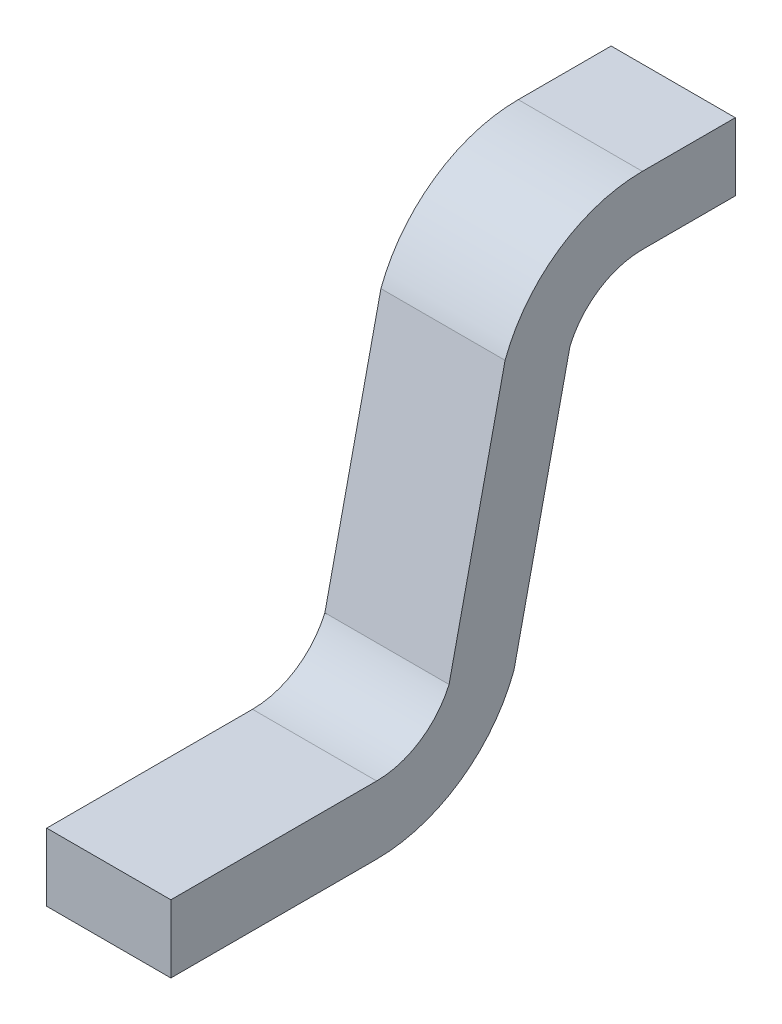
ISO-10303-21;
HEADER;
FILE_DESCRIPTION(('STEP AP214'),'2;1');
FILE_NAME('part.step','',(''),(''),'','','');
FILE_SCHEMA(('AUTOMOTIVE_DESIGN { 1 0 10303 214 1 1 1 1 }'));
ENDSEC;
DATA;
#1=APPLICATION_CONTEXT('core data for automotive mechanical design processes');
#2=APPLICATION_PROTOCOL_DEFINITION('international standard','automotive_design',2000,#1);
#3=PRODUCT_CONTEXT('',#1,'mechanical');
#4=PRODUCT('Part','Part','',(#3));
#5=PRODUCT_RELATED_PRODUCT_CATEGORY('part','',(#4));
#6=PRODUCT_DEFINITION_FORMATION('','',#4);
#7=PRODUCT_DEFINITION_CONTEXT('part definition',#1,'design');
#8=PRODUCT_DEFINITION('design','',#6,#7);
#9=PRODUCT_DEFINITION_SHAPE('','',#8);
#10=(LENGTH_UNIT() NAMED_UNIT(*) SI_UNIT(.MILLI.,.METRE.));
#11=(NAMED_UNIT(*) PLANE_ANGLE_UNIT() SI_UNIT($,.RADIAN.));
#12=(NAMED_UNIT(*) SI_UNIT($,.STERADIAN.) SOLID_ANGLE_UNIT());
#13=UNCERTAINTY_MEASURE_WITH_UNIT(LENGTH_MEASURE(1.E-05),#10,'distance_accuracy_value','');
#14=(GEOMETRIC_REPRESENTATION_CONTEXT(3) GLOBAL_UNCERTAINTY_ASSIGNED_CONTEXT((#13)) GLOBAL_UNIT_ASSIGNED_CONTEXT((#10,
#11,#12)) REPRESENTATION_CONTEXT('',''));
#15=CARTESIAN_POINT('',(0.,0.,0.));
#16=DIRECTION('',(0.,0.,1.));
#17=DIRECTION('',(1.,0.,0.));
#18=AXIS2_PLACEMENT_3D('',#15,#16,#17);
#19=CARTESIAN_POINT('',(0.,0.5,-0.835406592285));
#20=DIRECTION('',(1.,0.,0.));
#21=DIRECTION('',(0.,1.,0.));
#22=AXIS2_PLACEMENT_3D('',#19,#20,#21);
#23=PLANE('',#22);
#24=CARTESIAN_POINT('',(0.,0.5,-0.835406592285));
#25=DIRECTION('',(1.,0.,0.));
#26=DIRECTION('',(0.,0.,1.));
#27=AXIS2_PLACEMENT_3D('',#24,#25,#26);
#28=CIRCLE('',#27,0.14);
#29=CARTESIAN_POINT('',(0.,0.64,-0.835406592285));
#30=VERTEX_POINT('',#29);
#31=CARTESIAN_POINT('',(0.,0.556100456147,-0.707138362313));
#32=VERTEX_POINT('',#31);
#33=EDGE_CURVE('E144',#30,#32,#28,.T.);
#34=ORIENTED_EDGE('',*,*,#33,.T.);
#35=DIRECTION('',(0.,-0.976305215247216,0.216398074578048));
#36=VECTOR('',#35,1.);
#37=CARTESIAN_POINT('',(0.,0.112737980255,-0.608867058807));
#38=LINE('',#37,#36);
#39=CARTESIAN_POINT('',(0.,0.108285453512,-0.607880156146));
#40=VERTEX_POINT('',#39);
#41=EDGE_CURVE('E205',#32,#40,#38,.T.);
#42=ORIENTED_EDGE('',*,*,#41,.T.);
#43=CARTESIAN_POINT('',(0.,0.2,-0.364593407715));
#44=DIRECTION('',(1.,0.,0.));
#45=DIRECTION('',(0.,0.,1.));
#46=AXIS2_PLACEMENT_3D('',#43,#44,#45);
#47=CIRCLE('',#46,0.26);
#48=CARTESIAN_POINT('',(0.,-0.06,-0.364593407715));
#49=VERTEX_POINT('',#48);
#50=EDGE_CURVE('E201',#49,#40,#47,.T.);
#51=ORIENTED_EDGE('',*,*,#50,.F.);
#52=DIRECTION('',(0.,0.,1.));
#53=VECTOR('',#52,1.);
#54=CARTESIAN_POINT('',(0.,-0.06,0.));
#55=LINE('',#54,#53);
#56=CARTESIAN_POINT('',(0.,-0.06,0.));
#57=VERTEX_POINT('',#56);
#58=EDGE_CURVE('E200',#49,#57,#55,.T.);
#59=ORIENTED_EDGE('',*,*,#58,.T.);
#60=DIRECTION('',(0.,-1.,0.));
#61=VECTOR('',#60,1.);
#62=CARTESIAN_POINT('',(0.,-0.06,0.));
#63=LINE('',#62,#61);
#64=CARTESIAN_POINT('',(0.,0.06,0.));
#65=VERTEX_POINT('',#64);
#66=EDGE_CURVE('E219',#65,#57,#63,.T.);
#67=ORIENTED_EDGE('',*,*,#66,.F.);
#68=DIRECTION('',(0.,0.,1.));
#69=VECTOR('',#68,1.);
#70=CARTESIAN_POINT('',(0.,0.06,0.));
#71=LINE('',#70,#69);
#72=CARTESIAN_POINT('',(0.,0.06,-0.364593407715));
#73=VERTEX_POINT('',#72);
#74=EDGE_CURVE('E226',#73,#65,#71,.T.);
#75=ORIENTED_EDGE('',*,*,#74,.F.);
#76=CARTESIAN_POINT('',(0.,0.2,-0.364593407715));
#77=DIRECTION('',(1.,0.,0.));
#78=DIRECTION('',(0.,0.,1.));
#79=AXIS2_PLACEMENT_3D('',#76,#77,#78);
#80=CIRCLE('',#79,0.14);
#81=CARTESIAN_POINT('',(0.,0.143899543853,-0.492861637687));
#82=VERTEX_POINT('',#81);
#83=EDGE_CURVE('E232',#73,#82,#80,.T.);
#84=ORIENTED_EDGE('',*,*,#83,.T.);
#85=DIRECTION('',(0.,-0.976305215247216,0.216398074578048));
#86=VECTOR('',#85,1.);
#87=CARTESIAN_POINT('',(0.,0.138705749204,-0.491710432977));
#88=LINE('',#87,#86);
#89=CARTESIAN_POINT('',(0.,0.591714546488,-0.592119843854));
#90=VERTEX_POINT('',#89);
#91=EDGE_CURVE('E115',#90,#82,#88,.T.);
#92=ORIENTED_EDGE('',*,*,#91,.F.);
#93=CARTESIAN_POINT('',(0.,0.5,-0.835406592285));
#94=DIRECTION('',(1.,0.,0.));
#95=DIRECTION('',(0.,0.,1.));
#96=AXIS2_PLACEMENT_3D('',#93,#94,#95);
#97=CIRCLE('',#96,0.26);
#98=CARTESIAN_POINT('',(0.,0.76,-0.835406592285));
#99=VERTEX_POINT('',#98);
#100=EDGE_CURVE('E112',#99,#90,#97,.T.);
#101=ORIENTED_EDGE('',*,*,#100,.F.);
#102=DIRECTION('',(0.,0.,1.));
#103=VECTOR('',#102,1.);
#104=CARTESIAN_POINT('',(0.,0.76,-0.835406592285));
#105=LINE('',#104,#103);
#106=CARTESIAN_POINT('',(0.,0.76,-1.));
#107=VERTEX_POINT('',#106);
#108=EDGE_CURVE('E97',#107,#99,#105,.T.);
#109=ORIENTED_EDGE('',*,*,#108,.F.);
#110=DIRECTION('',(0.,1.,0.));
#111=VECTOR('',#110,1.);
#112=CARTESIAN_POINT('',(0.,0.76,-1.));
#113=LINE('',#112,#111);
#114=CARTESIAN_POINT('',(0.,0.64,-1.));
#115=VERTEX_POINT('',#114);
#116=EDGE_CURVE('E27',#115,#107,#113,.T.);
#117=ORIENTED_EDGE('',*,*,#116,.F.);
#118=DIRECTION('',(0.,0.,1.));
#119=VECTOR('',#118,1.);
#120=CARTESIAN_POINT('',(0.,0.64,-0.835406592285));
#121=LINE('',#120,#119);
#122=EDGE_CURVE('E11',#115,#30,#121,.T.);
#123=ORIENTED_EDGE('',*,*,#122,.T.);
#124=EDGE_LOOP('',(#34,#42,#51,#59,#67,#75,#84,#92,#101,#109,#117,#123));
#125=FACE_BOUND('',#124,.T.);
#126=ADVANCED_FACE('F17',(#125),#23,.F.);
#127=CARTESIAN_POINT('',(0.22,0.64,-0.835406592285));
#128=DIRECTION('',(0.,1.,0.));
#129=DIRECTION('',(1.,0.,0.));
#130=AXIS2_PLACEMENT_3D('',#127,#128,#129);
#131=PLANE('',#130);
#132=DIRECTION('',(-1.,0.,0.));
#133=VECTOR('',#132,1.);
#134=CARTESIAN_POINT('',(0.22,0.64,-1.));
#135=LINE('',#134,#133);
#136=CARTESIAN_POINT('',(0.22,0.64,-1.));
#137=VERTEX_POINT('',#136);
#138=EDGE_CURVE('E109',#137,#115,#135,.T.);
#139=ORIENTED_EDGE('',*,*,#138,.F.);
#140=DIRECTION('',(0.,0.,-1.));
#141=VECTOR('',#140,1.);
#142=CARTESIAN_POINT('',(0.22,0.64,-0.835406592285));
#143=LINE('',#142,#141);
#144=CARTESIAN_POINT('',(0.22,0.64,-0.835406592285));
#145=VERTEX_POINT('',#144);
#146=EDGE_CURVE('E160',#145,#137,#143,.T.);
#147=ORIENTED_EDGE('',*,*,#146,.F.);
#148=DIRECTION('',(-1.,0.,0.));
#149=VECTOR('',#148,1.);
#150=CARTESIAN_POINT('',(0.22,0.64,-0.835406592285));
#151=LINE('',#150,#149);
#152=EDGE_CURVE('E151',#145,#30,#151,.T.);
#153=ORIENTED_EDGE('',*,*,#152,.T.);
#154=ORIENTED_EDGE('',*,*,#122,.F.);
#155=EDGE_LOOP('',(#139,#147,#153,#154));
#156=FACE_BOUND('',#155,.T.);
#157=ADVANCED_FACE('F158',(#156),#131,.F.);
#158=CARTESIAN_POINT('',(0.22,0.76,-1.));
#159=DIRECTION('',(0.,0.,-1.));
#160=DIRECTION('',(0.,-1.,0.));
#161=AXIS2_PLACEMENT_3D('',#158,#159,#160);
#162=PLANE('',#161);
#163=DIRECTION('',(0.,1.,0.));
#164=VECTOR('',#163,1.);
#165=CARTESIAN_POINT('',(0.22,0.5,-1.));
#166=LINE('',#165,#164);
#167=CARTESIAN_POINT('',(0.22,0.76,-1.));
#168=VERTEX_POINT('',#167);
#169=EDGE_CURVE('E185',#137,#168,#166,.T.);
#170=ORIENTED_EDGE('',*,*,#169,.F.);
#171=ORIENTED_EDGE('',*,*,#138,.T.);
#172=ORIENTED_EDGE('',*,*,#116,.T.);
#173=DIRECTION('',(-1.,0.,0.));
#174=VECTOR('',#173,1.);
#175=CARTESIAN_POINT('',(0.22,0.76,-1.));
#176=LINE('',#175,#174);
#177=EDGE_CURVE('E106',#168,#107,#176,.T.);
#178=ORIENTED_EDGE('',*,*,#177,.F.);
#179=EDGE_LOOP('',(#170,#171,#172,#178));
#180=FACE_BOUND('',#179,.T.);
#181=ADVANCED_FACE('F140',(#180),#162,.T.);
#182=CARTESIAN_POINT('',(0.22,0.76,-0.835406592285));
#183=DIRECTION('',(0.,1.,0.));
#184=DIRECTION('',(1.,0.,0.));
#185=AXIS2_PLACEMENT_3D('',#182,#183,#184);
#186=PLANE('',#185);
#187=DIRECTION('',(0.,0.,1.));
#188=VECTOR('',#187,1.);
#189=CARTESIAN_POINT('',(0.22,0.76,-0.835406592285));
#190=LINE('',#189,#188);
#191=CARTESIAN_POINT('',(0.22,0.76,-0.835406592285));
#192=VERTEX_POINT('',#191);
#193=EDGE_CURVE('E189',#168,#192,#190,.T.);
#194=ORIENTED_EDGE('',*,*,#193,.F.);
#195=ORIENTED_EDGE('',*,*,#177,.T.);
#196=ORIENTED_EDGE('',*,*,#108,.T.);
#197=DIRECTION('',(-1.,0.,0.));
#198=VECTOR('',#197,1.);
#199=CARTESIAN_POINT('',(0.22,0.76,-0.835406592285));
#200=LINE('',#199,#198);
#201=EDGE_CURVE('E103',#192,#99,#200,.T.);
#202=ORIENTED_EDGE('',*,*,#201,.F.);
#203=EDGE_LOOP('',(#194,#195,#196,#202));
#204=FACE_BOUND('',#203,.T.);
#205=ADVANCED_FACE('F100',(#204),#186,.T.);
#206=CARTESIAN_POINT('',(0.22,0.5,-0.835406592285));
#207=DIRECTION('',(-1.,0.,0.));
#208=DIRECTION('',(0.,0.,1.));
#209=AXIS2_PLACEMENT_3D('',#206,#207,#208);
#210=CYLINDRICAL_SURFACE('',#209,0.26);
#211=CARTESIAN_POINT('',(0.22,0.5,-0.835406592285));
#212=DIRECTION('',(1.,0.,0.));
#213=DIRECTION('',(0.,0.,1.));
#214=AXIS2_PLACEMENT_3D('',#211,#212,#213);
#215=CIRCLE('',#214,0.26);
#216=CARTESIAN_POINT('',(0.22,0.591714546488,-0.592119843854));
#217=VERTEX_POINT('',#216);
#218=EDGE_CURVE('E122',#192,#217,#215,.T.);
#219=ORIENTED_EDGE('',*,*,#218,.F.);
#220=ORIENTED_EDGE('',*,*,#201,.T.);
#221=ORIENTED_EDGE('',*,*,#100,.T.);
#222=DIRECTION('',(-1.,0.,0.));
#223=VECTOR('',#222,1.);
#224=CARTESIAN_POINT('',(0.22,0.591714546488,-0.592119843854));
#225=LINE('',#224,#223);
#226=EDGE_CURVE('E129',#217,#90,#225,.T.);
#227=ORIENTED_EDGE('',*,*,#226,.F.);
#228=EDGE_LOOP('',(#219,#220,#221,#227));
#229=FACE_BOUND('',#228,.T.);
#230=ADVANCED_FACE('F19',(#229),#210,.T.);
#231=CARTESIAN_POINT('',(0.22,0.138705749204,-0.491710432977));
#232=DIRECTION('',(0.,0.216398074578048,0.976305215247216));
#233=DIRECTION('',(1.,0.,0.));
#234=AXIS2_PLACEMENT_3D('',#231,#232,#233);
#235=PLANE('',#234);
#236=DIRECTION('',(0.,-0.976305215247216,0.216398074578048));
#237=VECTOR('',#236,1.);
#238=CARTESIAN_POINT('',(0.22,0.591714546488,-0.592119843854));
#239=LINE('',#238,#237);
#240=CARTESIAN_POINT('',(0.22,0.143899543853,-0.492861637687));
#241=VERTEX_POINT('',#240);
#242=EDGE_CURVE('E180',#217,#241,#239,.T.);
#243=ORIENTED_EDGE('',*,*,#242,.F.);
#244=ORIENTED_EDGE('',*,*,#226,.T.);
#245=ORIENTED_EDGE('',*,*,#91,.T.);
#246=DIRECTION('',(1.,0.,0.));
#247=VECTOR('',#246,1.);
#248=CARTESIAN_POINT('',(0.22,0.143899543853,-0.492861637687));
#249=LINE('',#248,#247);
#250=EDGE_CURVE('E229',#82,#241,#249,.T.);
#251=ORIENTED_EDGE('',*,*,#250,.T.);
#252=EDGE_LOOP('',(#243,#244,#245,#251));
#253=FACE_BOUND('',#252,.T.);
#254=ADVANCED_FACE('F239',(#253),#235,.T.);
#255=CARTESIAN_POINT('',(0.22,0.2,-0.364593407715));
#256=DIRECTION('',(-1.,0.,0.));
#257=DIRECTION('',(0.,0.,1.));
#258=AXIS2_PLACEMENT_3D('',#255,#256,#257);
#259=CYLINDRICAL_SURFACE('',#258,0.14);
#260=DIRECTION('',(-1.,0.,0.));
#261=VECTOR('',#260,1.);
#262=CARTESIAN_POINT('',(0.22,0.06,-0.364593407715));
#263=LINE('',#262,#261);
#264=CARTESIAN_POINT('',(0.22,0.06,-0.364593407715));
#265=VERTEX_POINT('',#264);
#266=EDGE_CURVE('E222',#265,#73,#263,.T.);
#267=ORIENTED_EDGE('',*,*,#266,.F.);
#268=CARTESIAN_POINT('',(0.22,0.2,-0.364593407715));
#269=DIRECTION('',(-1.,0.,0.));
#270=DIRECTION('',(0.,0.,1.));
#271=AXIS2_PLACEMENT_3D('',#268,#269,#270);
#272=CIRCLE('',#271,0.14);
#273=EDGE_CURVE('E175',#241,#265,#272,.T.);
#274=ORIENTED_EDGE('',*,*,#273,.F.);
#275=ORIENTED_EDGE('',*,*,#250,.F.);
#276=ORIENTED_EDGE('',*,*,#83,.F.);
#277=EDGE_LOOP('',(#267,#274,#275,#276));
#278=FACE_BOUND('',#277,.T.);
#279=ADVANCED_FACE('F262',(#278),#259,.F.);
#280=CARTESIAN_POINT('',(0.22,0.06,0.));
#281=DIRECTION('',(0.,1.,0.));
#282=DIRECTION('',(1.,0.,0.));
#283=AXIS2_PLACEMENT_3D('',#280,#281,#282);
#284=PLANE('',#283);
#285=DIRECTION('',(0.,0.,1.));
#286=VECTOR('',#285,1.);
#287=CARTESIAN_POINT('',(0.22,0.06,-0.835406592285));
#288=LINE('',#287,#286);
#289=CARTESIAN_POINT('',(0.22,0.06,0.));
#290=VERTEX_POINT('',#289);
#291=EDGE_CURVE('E179',#265,#290,#288,.T.);
#292=ORIENTED_EDGE('',*,*,#291,.F.);
#293=ORIENTED_EDGE('',*,*,#266,.T.);
#294=ORIENTED_EDGE('',*,*,#74,.T.);
#295=DIRECTION('',(-1.,0.,0.));
#296=VECTOR('',#295,1.);
#297=CARTESIAN_POINT('',(0.22,0.06,0.));
#298=LINE('',#297,#296);
#299=EDGE_CURVE('E215',#290,#65,#298,.T.);
#300=ORIENTED_EDGE('',*,*,#299,.F.);
#301=EDGE_LOOP('',(#292,#293,#294,#300));
#302=FACE_BOUND('',#301,.T.);
#303=ADVANCED_FACE('F267',(#302),#284,.T.);
#304=CARTESIAN_POINT('',(0.22,-0.06,0.));
#305=DIRECTION('',(0.,0.,1.));
#306=DIRECTION('',(1.,0.,0.));
#307=AXIS2_PLACEMENT_3D('',#304,#305,#306);
#308=PLANE('',#307);
#309=DIRECTION('',(0.,-1.,0.));
#310=VECTOR('',#309,1.);
#311=CARTESIAN_POINT('',(0.22,0.5,0.));
#312=LINE('',#311,#310);
#313=CARTESIAN_POINT('',(0.22,-0.06,0.));
#314=VERTEX_POINT('',#313);
#315=EDGE_CURVE('E181',#290,#314,#312,.T.);
#316=ORIENTED_EDGE('',*,*,#315,.F.);
#317=ORIENTED_EDGE('',*,*,#299,.T.);
#318=ORIENTED_EDGE('',*,*,#66,.T.);
#319=DIRECTION('',(1.,0.,0.));
#320=VECTOR('',#319,1.);
#321=CARTESIAN_POINT('',(0.22,-0.06,0.));
#322=LINE('',#321,#320);
#323=EDGE_CURVE('E197',#57,#314,#322,.T.);
#324=ORIENTED_EDGE('',*,*,#323,.T.);
#325=EDGE_LOOP('',(#316,#317,#318,#324));
#326=FACE_BOUND('',#325,.T.);
#327=ADVANCED_FACE('F423',(#326),#308,.T.);
#328=CARTESIAN_POINT('',(0.22,-0.06,0.));
#329=DIRECTION('',(0.,1.,0.));
#330=DIRECTION('',(1.,0.,0.));
#331=AXIS2_PLACEMENT_3D('',#328,#329,#330);
#332=PLANE('',#331);
#333=DIRECTION('',(-1.,0.,0.));
#334=VECTOR('',#333,1.);
#335=CARTESIAN_POINT('',(0.22,-0.06,-0.364593407715));
#336=LINE('',#335,#334);
#337=CARTESIAN_POINT('',(0.22,-0.06,-0.364593407715));
#338=VERTEX_POINT('',#337);
#339=EDGE_CURVE('E208',#338,#49,#336,.T.);
#340=ORIENTED_EDGE('',*,*,#339,.F.);
#341=DIRECTION('',(0.,0.,-1.));
#342=VECTOR('',#341,1.);
#343=CARTESIAN_POINT('',(0.22,-0.06,-0.835406592285));
#344=LINE('',#343,#342);
#345=EDGE_CURVE('E170',#314,#338,#344,.T.);
#346=ORIENTED_EDGE('',*,*,#345,.F.);
#347=ORIENTED_EDGE('',*,*,#323,.F.);
#348=ORIENTED_EDGE('',*,*,#58,.F.);
#349=EDGE_LOOP('',(#340,#346,#347,#348));
#350=FACE_BOUND('',#349,.T.);
#351=ADVANCED_FACE('F432',(#350),#332,.F.);
#352=CARTESIAN_POINT('',(0.22,0.2,-0.364593407715));
#353=DIRECTION('',(-1.,0.,0.));
#354=DIRECTION('',(0.,0.,1.));
#355=AXIS2_PLACEMENT_3D('',#352,#353,#354);
#356=CYLINDRICAL_SURFACE('',#355,0.26);
#357=CARTESIAN_POINT('',(0.22,0.2,-0.364593407715));
#358=DIRECTION('',(1.,0.,0.));
#359=DIRECTION('',(0.,0.,1.));
#360=AXIS2_PLACEMENT_3D('',#357,#358,#359);
#361=CIRCLE('',#360,0.26);
#362=CARTESIAN_POINT('',(0.22,0.108285453512,-0.607880156146));
#363=VERTEX_POINT('',#362);
#364=EDGE_CURVE('E163',#338,#363,#361,.T.);
#365=ORIENTED_EDGE('',*,*,#364,.F.);
#366=ORIENTED_EDGE('',*,*,#339,.T.);
#367=ORIENTED_EDGE('',*,*,#50,.T.);
#368=DIRECTION('',(1.,0.,0.));
#369=VECTOR('',#368,1.);
#370=CARTESIAN_POINT('',(0.22,0.108285453512,-0.607880156146));
#371=LINE('',#370,#369);
#372=EDGE_CURVE('E156',#40,#363,#371,.T.);
#373=ORIENTED_EDGE('',*,*,#372,.T.);
#374=EDGE_LOOP('',(#365,#366,#367,#373));
#375=FACE_BOUND('',#374,.T.);
#376=ADVANCED_FACE('F444',(#375),#356,.T.);
#377=CARTESIAN_POINT('',(0.22,0.112737980255,-0.608867058807));
#378=DIRECTION('',(0.,0.216398074578048,0.976305215247216));
#379=DIRECTION('',(1.,0.,0.));
#380=AXIS2_PLACEMENT_3D('',#377,#378,#379);
#381=PLANE('',#380);
#382=DIRECTION('',(1.,0.,0.));
#383=VECTOR('',#382,1.);
#384=CARTESIAN_POINT('',(0.22,0.556100456147,-0.707138362313));
#385=LINE('',#384,#383);
#386=CARTESIAN_POINT('',(0.22,0.556100456147,-0.707138362313));
#387=VERTEX_POINT('',#386);
#388=EDGE_CURVE('E154',#32,#387,#385,.T.);
#389=ORIENTED_EDGE('',*,*,#388,.T.);
#390=DIRECTION('',(0.,0.976305215247216,-0.216398074578048));
#391=VECTOR('',#390,1.);
#392=CARTESIAN_POINT('',(0.22,0.108285453512,-0.607880156146));
#393=LINE('',#392,#391);
#394=EDGE_CURVE('E279',#363,#387,#393,.T.);
#395=ORIENTED_EDGE('',*,*,#394,.F.);
#396=ORIENTED_EDGE('',*,*,#372,.F.);
#397=ORIENTED_EDGE('',*,*,#41,.F.);
#398=EDGE_LOOP('',(#389,#395,#396,#397));
#399=FACE_BOUND('',#398,.T.);
#400=ADVANCED_FACE('F296',(#399),#381,.F.);
#401=CARTESIAN_POINT('',(0.22,0.5,-0.835406592285));
#402=DIRECTION('',(-1.,0.,0.));
#403=DIRECTION('',(0.,0.,1.));
#404=AXIS2_PLACEMENT_3D('',#401,#402,#403);
#405=CYLINDRICAL_SURFACE('',#404,0.14);
#406=ORIENTED_EDGE('',*,*,#152,.F.);
#407=CARTESIAN_POINT('',(0.22,0.5,-0.835406592285));
#408=DIRECTION('',(-1.,0.,0.));
#409=DIRECTION('',(0.,0.,1.));
#410=AXIS2_PLACEMENT_3D('',#407,#408,#409);
#411=CIRCLE('',#410,0.14);
#412=EDGE_CURVE('E283',#387,#145,#411,.T.);
#413=ORIENTED_EDGE('',*,*,#412,.F.);
#414=ORIENTED_EDGE('',*,*,#388,.F.);
#415=ORIENTED_EDGE('',*,*,#33,.F.);
#416=EDGE_LOOP('',(#406,#413,#414,#415));
#417=FACE_BOUND('',#416,.T.);
#418=ADVANCED_FACE('F148',(#417),#405,.F.);
#419=CARTESIAN_POINT('',(0.22,0.5,-0.835406592285));
#420=DIRECTION('',(1.,0.,0.));
#421=DIRECTION('',(0.,1.,0.));
#422=AXIS2_PLACEMENT_3D('',#419,#420,#421);
#423=PLANE('',#422);
#424=ORIENTED_EDGE('',*,*,#394,.T.);
#425=ORIENTED_EDGE('',*,*,#412,.T.);
#426=ORIENTED_EDGE('',*,*,#146,.T.);
#427=ORIENTED_EDGE('',*,*,#169,.T.);
#428=ORIENTED_EDGE('',*,*,#193,.T.);
#429=ORIENTED_EDGE('',*,*,#218,.T.);
#430=ORIENTED_EDGE('',*,*,#242,.T.);
#431=ORIENTED_EDGE('',*,*,#273,.T.);
#432=ORIENTED_EDGE('',*,*,#291,.T.);
#433=ORIENTED_EDGE('',*,*,#315,.T.);
#434=ORIENTED_EDGE('',*,*,#345,.T.);
#435=ORIENTED_EDGE('',*,*,#364,.T.);
#436=EDGE_LOOP('',(#424,#425,#426,#427,#428,#429,#430,#431,#432,#433,#434,#435));
#437=FACE_BOUND('',#436,.T.);
#438=ADVANCED_FACE('F273',(#437),#423,.T.);
#439=CLOSED_SHELL('',(#126,#157,#181,#205,#230,#254,#279,#303,#327,#351,#376,#400,#418,#438));
#440=MANIFOLD_SOLID_BREP('B1',#439);
#441=ADVANCED_BREP_SHAPE_REPRESENTATION('',(#18,#440),#14);
#442=SHAPE_DEFINITION_REPRESENTATION(#9,#441);
ENDSEC;
END-ISO-10303-21;
